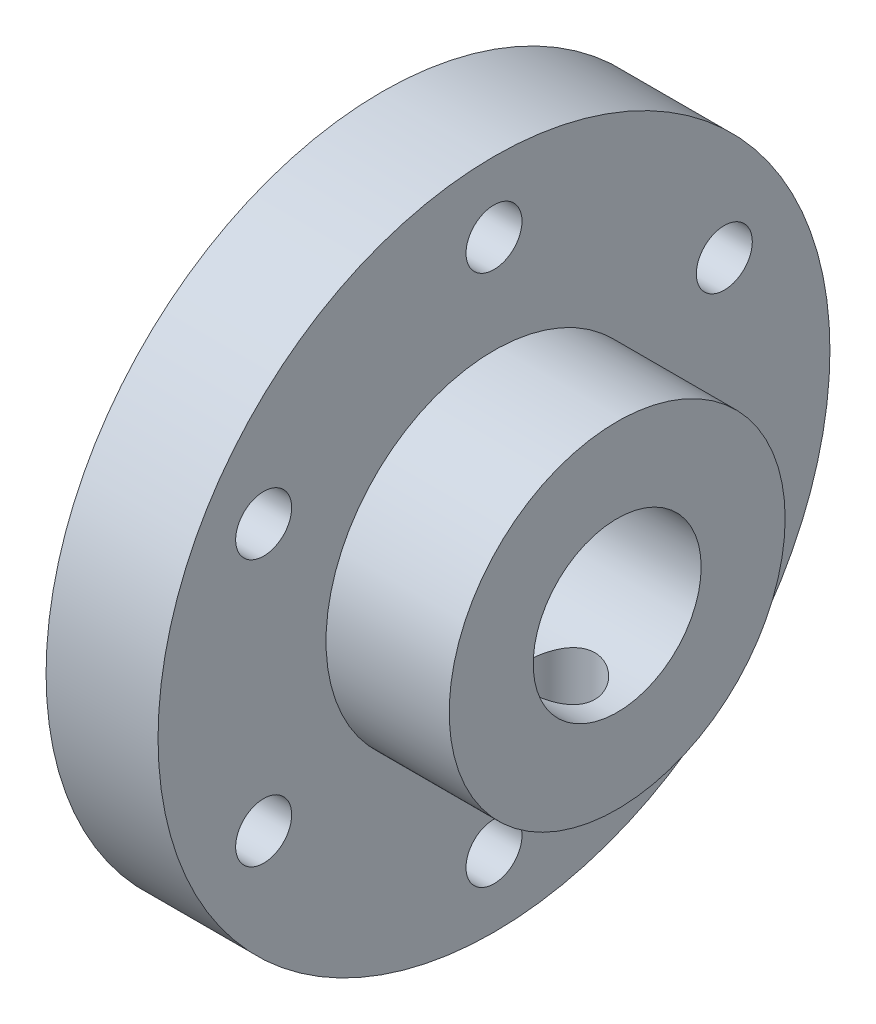
ISO-10303-21;
HEADER;
FILE_DESCRIPTION(('STEP AP214'),'2;1');
FILE_NAME('part.step','',(''),(''),'','','');
FILE_SCHEMA(('AUTOMOTIVE_DESIGN { 1 0 10303 214 1 1 1 1 }'));
ENDSEC;
DATA;
#1=APPLICATION_CONTEXT('core data for automotive mechanical design processes');
#2=APPLICATION_PROTOCOL_DEFINITION('international standard','automotive_design',2000,#1);
#3=PRODUCT_CONTEXT('',#1,'mechanical');
#4=PRODUCT('Part','Part','',(#3));
#5=PRODUCT_RELATED_PRODUCT_CATEGORY('part','',(#4));
#6=PRODUCT_DEFINITION_FORMATION('','',#4);
#7=PRODUCT_DEFINITION_CONTEXT('part definition',#1,'design');
#8=PRODUCT_DEFINITION('design','',#6,#7);
#9=PRODUCT_DEFINITION_SHAPE('','',#8);
#10=(LENGTH_UNIT() NAMED_UNIT(*) SI_UNIT(.MILLI.,.METRE.));
#11=(NAMED_UNIT(*) PLANE_ANGLE_UNIT() SI_UNIT($,.RADIAN.));
#12=(NAMED_UNIT(*) SI_UNIT($,.STERADIAN.) SOLID_ANGLE_UNIT());
#13=UNCERTAINTY_MEASURE_WITH_UNIT(LENGTH_MEASURE(1.E-05),#10,'distance_accuracy_value','');
#14=(GEOMETRIC_REPRESENTATION_CONTEXT(3) GLOBAL_UNCERTAINTY_ASSIGNED_CONTEXT((#13)) GLOBAL_UNIT_ASSIGNED_CONTEXT((#10,
#11,#12)) REPRESENTATION_CONTEXT('',''));
#15=CARTESIAN_POINT('',(0.,0.,0.));
#16=DIRECTION('',(0.,0.,1.));
#17=DIRECTION('',(1.,0.,0.));
#18=AXIS2_PLACEMENT_3D('',#15,#16,#17);
#19=CARTESIAN_POINT('',(10.,0.,0.));
#20=DIRECTION('',(-1.,0.,0.));
#21=DIRECTION('',(0.,0.,1.));
#22=AXIS2_PLACEMENT_3D('',#19,#20,#21);
#23=CYLINDRICAL_SURFACE('',#22,30.);
#24=CARTESIAN_POINT('',(10.,0.,0.));
#25=DIRECTION('',(1.,0.,0.));
#26=DIRECTION('',(0.,0.,-1.));
#27=AXIS2_PLACEMENT_3D('',#24,#25,#26);
#28=CIRCLE('',#27,30.);
#29=CARTESIAN_POINT('',(10.,0.,-30.));
#30=VERTEX_POINT('',#29);
#31=EDGE_CURVE('E43',#30,#30,#28,.T.);
#32=ORIENTED_EDGE('',*,*,#31,.F.);
#33=EDGE_LOOP('',(#32));
#34=FACE_BOUND('',#33,.T.);
#35=CARTESIAN_POINT('',(0.,0.,0.));
#36=DIRECTION('',(1.,0.,0.));
#37=DIRECTION('',(0.,0.,-1.));
#38=AXIS2_PLACEMENT_3D('',#35,#36,#37);
#39=CIRCLE('',#38,30.);
#40=CARTESIAN_POINT('',(0.,0.,-30.));
#41=VERTEX_POINT('',#40);
#42=EDGE_CURVE('E47',#41,#41,#39,.T.);
#43=ORIENTED_EDGE('',*,*,#42,.T.);
#44=EDGE_LOOP('',(#43));
#45=FACE_BOUND('',#44,.T.);
#46=ADVANCED_FACE('F37',(#34,#45),#23,.T.);
#47=CARTESIAN_POINT('',(10.,0.,0.));
#48=DIRECTION('',(1.,0.,0.));
#49=DIRECTION('',(0.,0.,-1.));
#50=AXIS2_PLACEMENT_3D('',#47,#48,#49);
#51=PLANE('',#50);
#52=CARTESIAN_POINT('',(10.,0.,0.));
#53=DIRECTION('',(1.,0.,0.));
#54=DIRECTION('',(0.,0.,-1.));
#55=AXIS2_PLACEMENT_3D('',#52,#53,#54);
#56=CIRCLE('',#55,15.);
#57=CARTESIAN_POINT('',(10.,0.,-15.));
#58=VERTEX_POINT('',#57);
#59=EDGE_CURVE('E92',#58,#58,#56,.T.);
#60=ORIENTED_EDGE('',*,*,#59,.F.);
#61=EDGE_LOOP('',(#60));
#62=FACE_BOUND('',#61,.T.);
#63=CARTESIAN_POINT('',(10.,23.75,0.));
#64=DIRECTION('',(1.,0.,0.));
#65=DIRECTION('',(0.,0.,-1.));
#66=AXIS2_PLACEMENT_3D('',#63,#64,#65);
#67=CIRCLE('',#66,2.5);
#68=CARTESIAN_POINT('',(10.,23.75,-2.5));
#69=VERTEX_POINT('',#68);
#70=EDGE_CURVE('E79',#69,#69,#67,.T.);
#71=ORIENTED_EDGE('',*,*,#70,.F.);
#72=EDGE_LOOP('',(#71));
#73=FACE_BOUND('',#72,.T.);
#74=CARTESIAN_POINT('',(10.,11.8749999999991,20.5681033398799));
#75=DIRECTION('',(1.,0.,0.));
#76=DIRECTION('',(0.,0.,-1.));
#77=AXIS2_PLACEMENT_3D('',#74,#75,#76);
#78=CIRCLE('',#77,2.5);
#79=CARTESIAN_POINT('',(10.,11.8749999999991,18.0681033398799));
#80=VERTEX_POINT('',#79);
#81=EDGE_CURVE('E80',#80,#80,#78,.T.);
#82=ORIENTED_EDGE('',*,*,#81,.F.);
#83=EDGE_LOOP('',(#82));
#84=FACE_BOUND('',#83,.T.);
#85=CARTESIAN_POINT('',(10.,-11.8750000000009,20.5681033398789));
#86=DIRECTION('',(1.,0.,0.));
#87=DIRECTION('',(0.,0.,-1.));
#88=AXIS2_PLACEMENT_3D('',#85,#86,#87);
#89=CIRCLE('',#88,2.5);
#90=CARTESIAN_POINT('',(10.,-11.8750000000009,18.0681033398789));
#91=VERTEX_POINT('',#90);
#92=EDGE_CURVE('E54',#91,#91,#89,.T.);
#93=ORIENTED_EDGE('',*,*,#92,.F.);
#94=EDGE_LOOP('',(#93));
#95=FACE_BOUND('',#94,.T.);
#96=CARTESIAN_POINT('',(10.,-23.75,-2.07990264065103E-12));
#97=DIRECTION('',(1.,0.,0.));
#98=DIRECTION('',(0.,0.,-1.));
#99=AXIS2_PLACEMENT_3D('',#96,#97,#98);
#100=CIRCLE('',#99,2.5);
#101=CARTESIAN_POINT('',(10.,-23.75,-2.50000000000208));
#102=VERTEX_POINT('',#101);
#103=EDGE_CURVE('E61',#102,#102,#100,.T.);
#104=ORIENTED_EDGE('',*,*,#103,.F.);
#105=EDGE_LOOP('',(#104));
#106=FACE_BOUND('',#105,.T.);
#107=CARTESIAN_POINT('',(10.,-11.8749999999991,-20.568103339882));
#108=DIRECTION('',(1.,0.,0.));
#109=DIRECTION('',(0.,0.,-1.));
#110=AXIS2_PLACEMENT_3D('',#107,#108,#109);
#111=CIRCLE('',#110,2.5);
#112=CARTESIAN_POINT('',(10.,-11.8749999999991,-23.068103339882));
#113=VERTEX_POINT('',#112);
#114=EDGE_CURVE('E67',#113,#113,#111,.T.);
#115=ORIENTED_EDGE('',*,*,#114,.F.);
#116=EDGE_LOOP('',(#115));
#117=FACE_BOUND('',#116,.T.);
#118=CARTESIAN_POINT('',(10.,11.8750000000009,-20.5681033398809));
#119=DIRECTION('',(1.,0.,0.));
#120=DIRECTION('',(0.,0.,-1.));
#121=AXIS2_PLACEMENT_3D('',#118,#119,#120);
#122=CIRCLE('',#121,2.5);
#123=CARTESIAN_POINT('',(10.,11.8750000000009,-23.0681033398809));
#124=VERTEX_POINT('',#123);
#125=EDGE_CURVE('E73',#124,#124,#122,.T.);
#126=ORIENTED_EDGE('',*,*,#125,.F.);
#127=EDGE_LOOP('',(#126));
#128=FACE_BOUND('',#127,.T.);
#129=ORIENTED_EDGE('',*,*,#31,.T.);
#130=EDGE_LOOP('',(#129));
#131=FACE_BOUND('',#130,.T.);
#132=ADVANCED_FACE('F166',(#62,#73,#84,#95,#106,#117,#128,#131),#51,.T.);
#133=CARTESIAN_POINT('',(0.,0.,0.));
#134=DIRECTION('',(1.,0.,0.));
#135=DIRECTION('',(0.,0.,-1.));
#136=AXIS2_PLACEMENT_3D('',#133,#134,#135);
#137=PLANE('',#136);
#138=CARTESIAN_POINT('',(0.,0.,0.));
#139=DIRECTION('',(1.,0.,0.));
#140=DIRECTION('',(0.,0.,-1.));
#141=AXIS2_PLACEMENT_3D('',#138,#139,#140);
#142=CIRCLE('',#141,14.);
#143=CARTESIAN_POINT('',(0.,0.,-14.));
#144=VERTEX_POINT('',#143);
#145=EDGE_CURVE('E10',#144,#144,#142,.F.);
#146=ORIENTED_EDGE('',*,*,#145,.F.);
#147=EDGE_LOOP('',(#146));
#148=FACE_BOUND('',#147,.T.);
#149=CARTESIAN_POINT('',(0.,23.75,0.));
#150=DIRECTION('',(1.,0.,0.));
#151=DIRECTION('',(0.,0.,-1.));
#152=AXIS2_PLACEMENT_3D('',#149,#150,#151);
#153=CIRCLE('',#152,2.5);
#154=CARTESIAN_POINT('',(0.,23.75,-2.5));
#155=VERTEX_POINT('',#154);
#156=EDGE_CURVE('E52',#155,#155,#153,.T.);
#157=ORIENTED_EDGE('',*,*,#156,.T.);
#158=EDGE_LOOP('',(#157));
#159=FACE_BOUND('',#158,.T.);
#160=CARTESIAN_POINT('',(0.,11.8749999999991,20.5681033398799));
#161=DIRECTION('',(1.,0.,0.));
#162=DIRECTION('',(0.,0.,-1.));
#163=AXIS2_PLACEMENT_3D('',#160,#161,#162);
#164=CIRCLE('',#163,2.5);
#165=CARTESIAN_POINT('',(0.,11.8749999999991,18.0681033398799));
#166=VERTEX_POINT('',#165);
#167=EDGE_CURVE('E58',#166,#166,#164,.T.);
#168=ORIENTED_EDGE('',*,*,#167,.T.);
#169=EDGE_LOOP('',(#168));
#170=FACE_BOUND('',#169,.T.);
#171=CARTESIAN_POINT('',(0.,-11.8750000000009,20.5681033398789));
#172=DIRECTION('',(1.,0.,0.));
#173=DIRECTION('',(0.,0.,-1.));
#174=AXIS2_PLACEMENT_3D('',#171,#172,#173);
#175=CIRCLE('',#174,2.5);
#176=CARTESIAN_POINT('',(0.,-11.8750000000009,18.0681033398789));
#177=VERTEX_POINT('',#176);
#178=EDGE_CURVE('E57',#177,#177,#175,.T.);
#179=ORIENTED_EDGE('',*,*,#178,.T.);
#180=EDGE_LOOP('',(#179));
#181=FACE_BOUND('',#180,.T.);
#182=CARTESIAN_POINT('',(0.,-23.75,-2.07990264065103E-12));
#183=DIRECTION('',(1.,0.,0.));
#184=DIRECTION('',(0.,0.,-1.));
#185=AXIS2_PLACEMENT_3D('',#182,#183,#184);
#186=CIRCLE('',#185,2.5);
#187=CARTESIAN_POINT('',(0.,-23.75,-2.50000000000208));
#188=VERTEX_POINT('',#187);
#189=EDGE_CURVE('E64',#188,#188,#186,.T.);
#190=ORIENTED_EDGE('',*,*,#189,.T.);
#191=EDGE_LOOP('',(#190));
#192=FACE_BOUND('',#191,.T.);
#193=CARTESIAN_POINT('',(0.,-11.8749999999991,-20.568103339882));
#194=DIRECTION('',(1.,0.,0.));
#195=DIRECTION('',(0.,0.,-1.));
#196=AXIS2_PLACEMENT_3D('',#193,#194,#195);
#197=CIRCLE('',#196,2.5);
#198=CARTESIAN_POINT('',(0.,-11.8749999999991,-23.068103339882));
#199=VERTEX_POINT('',#198);
#200=EDGE_CURVE('E70',#199,#199,#197,.T.);
#201=ORIENTED_EDGE('',*,*,#200,.T.);
#202=EDGE_LOOP('',(#201));
#203=FACE_BOUND('',#202,.T.);
#204=CARTESIAN_POINT('',(0.,11.8750000000009,-20.5681033398809));
#205=DIRECTION('',(1.,0.,0.));
#206=DIRECTION('',(0.,0.,-1.));
#207=AXIS2_PLACEMENT_3D('',#204,#205,#206);
#208=CIRCLE('',#207,2.5);
#209=CARTESIAN_POINT('',(0.,11.8750000000009,-23.0681033398809));
#210=VERTEX_POINT('',#209);
#211=EDGE_CURVE('E76',#210,#210,#208,.T.);
#212=ORIENTED_EDGE('',*,*,#211,.T.);
#213=EDGE_LOOP('',(#212));
#214=FACE_BOUND('',#213,.T.);
#215=ORIENTED_EDGE('',*,*,#42,.F.);
#216=EDGE_LOOP('',(#215));
#217=FACE_BOUND('',#216,.T.);
#218=ADVANCED_FACE('F154',(#148,#159,#170,#181,#192,#203,#214,#217),#137,.F.);
#219=CARTESIAN_POINT('',(0.,11.8750000000009,-20.5681033398809));
#220=DIRECTION('',(1.,0.,0.));
#221=DIRECTION('',(0.,0.,-1.));
#222=AXIS2_PLACEMENT_3D('',#219,#220,#221);
#223=CYLINDRICAL_SURFACE('',#222,2.5);
#224=ORIENTED_EDGE('',*,*,#211,.F.);
#225=EDGE_LOOP('',(#224));
#226=FACE_BOUND('',#225,.T.);
#227=ORIENTED_EDGE('',*,*,#125,.T.);
#228=EDGE_LOOP('',(#227));
#229=FACE_BOUND('',#228,.T.);
#230=ADVANCED_FACE('F150',(#226,#229),#223,.F.);
#231=CARTESIAN_POINT('',(0.,-11.8749999999991,-20.568103339882));
#232=DIRECTION('',(1.,0.,0.));
#233=DIRECTION('',(0.,0.,-1.));
#234=AXIS2_PLACEMENT_3D('',#231,#232,#233);
#235=CYLINDRICAL_SURFACE('',#234,2.5);
#236=ORIENTED_EDGE('',*,*,#200,.F.);
#237=EDGE_LOOP('',(#236));
#238=FACE_BOUND('',#237,.T.);
#239=ORIENTED_EDGE('',*,*,#114,.T.);
#240=EDGE_LOOP('',(#239));
#241=FACE_BOUND('',#240,.T.);
#242=ADVANCED_FACE('F153',(#238,#241),#235,.F.);
#243=CARTESIAN_POINT('',(0.,-23.75,-2.07990264065103E-12));
#244=DIRECTION('',(1.,0.,0.));
#245=DIRECTION('',(0.,0.,-1.));
#246=AXIS2_PLACEMENT_3D('',#243,#244,#245);
#247=CYLINDRICAL_SURFACE('',#246,2.5);
#248=ORIENTED_EDGE('',*,*,#189,.F.);
#249=EDGE_LOOP('',(#248));
#250=FACE_BOUND('',#249,.T.);
#251=ORIENTED_EDGE('',*,*,#103,.T.);
#252=EDGE_LOOP('',(#251));
#253=FACE_BOUND('',#252,.T.);
#254=ADVANCED_FACE('F158',(#250,#253),#247,.F.);
#255=CARTESIAN_POINT('',(0.,-11.8750000000009,20.5681033398789));
#256=DIRECTION('',(1.,0.,0.));
#257=DIRECTION('',(0.,0.,-1.));
#258=AXIS2_PLACEMENT_3D('',#255,#256,#257);
#259=CYLINDRICAL_SURFACE('',#258,2.5);
#260=ORIENTED_EDGE('',*,*,#178,.F.);
#261=EDGE_LOOP('',(#260));
#262=FACE_BOUND('',#261,.T.);
#263=ORIENTED_EDGE('',*,*,#92,.T.);
#264=EDGE_LOOP('',(#263));
#265=FACE_BOUND('',#264,.T.);
#266=ADVANCED_FACE('F148',(#262,#265),#259,.F.);
#267=CARTESIAN_POINT('',(0.,11.8749999999991,20.5681033398799));
#268=DIRECTION('',(1.,0.,0.));
#269=DIRECTION('',(0.,0.,-1.));
#270=AXIS2_PLACEMENT_3D('',#267,#268,#269);
#271=CYLINDRICAL_SURFACE('',#270,2.5);
#272=ORIENTED_EDGE('',*,*,#167,.F.);
#273=EDGE_LOOP('',(#272));
#274=FACE_BOUND('',#273,.T.);
#275=ORIENTED_EDGE('',*,*,#81,.T.);
#276=EDGE_LOOP('',(#275));
#277=FACE_BOUND('',#276,.T.);
#278=ADVANCED_FACE('F144',(#274,#277),#271,.F.);
#279=CARTESIAN_POINT('',(0.,23.75,0.));
#280=DIRECTION('',(1.,0.,0.));
#281=DIRECTION('',(0.,0.,-1.));
#282=AXIS2_PLACEMENT_3D('',#279,#280,#281);
#283=CYLINDRICAL_SURFACE('',#282,2.5);
#284=ORIENTED_EDGE('',*,*,#156,.F.);
#285=EDGE_LOOP('',(#284));
#286=FACE_BOUND('',#285,.T.);
#287=ORIENTED_EDGE('',*,*,#70,.T.);
#288=EDGE_LOOP('',(#287));
#289=FACE_BOUND('',#288,.T.);
#290=ADVANCED_FACE('F140',(#286,#289),#283,.F.);
#291=CARTESIAN_POINT('',(-6.,0.,0.));
#292=DIRECTION('',(1.,0.,0.));
#293=DIRECTION('',(0.,0.,-1.));
#294=AXIS2_PLACEMENT_3D('',#291,#292,#293);
#295=CYLINDRICAL_SURFACE('',#294,14.);
#296=CARTESIAN_POINT('',(-6.,0.,0.));
#297=DIRECTION('',(-1.,0.,0.));
#298=DIRECTION('',(0.,0.,1.));
#299=AXIS2_PLACEMENT_3D('',#296,#297,#298);
#300=CIRCLE('',#299,14.);
#301=CARTESIAN_POINT('',(-6.,0.,14.));
#302=VERTEX_POINT('',#301);
#303=EDGE_CURVE('E83',#302,#302,#300,.T.);
#304=ORIENTED_EDGE('',*,*,#303,.F.);
#305=EDGE_LOOP('',(#304));
#306=FACE_BOUND('',#305,.T.);
#307=ORIENTED_EDGE('',*,*,#145,.T.);
#308=EDGE_LOOP('',(#307));
#309=FACE_BOUND('',#308,.T.);
#310=ADVANCED_FACE('F136',(#306,#309),#295,.T.);
#311=CARTESIAN_POINT('',(-6.,0.,0.));
#312=DIRECTION('',(-1.,0.,0.));
#313=DIRECTION('',(0.,0.,1.));
#314=AXIS2_PLACEMENT_3D('',#311,#312,#313);
#315=PLANE('',#314);
#316=CARTESIAN_POINT('',(-6.,0.,0.));
#317=DIRECTION('',(-1.,0.,0.));
#318=DIRECTION('',(0.,0.,1.));
#319=AXIS2_PLACEMENT_3D('',#316,#317,#318);
#320=CIRCLE('',#319,7.5);
#321=CARTESIAN_POINT('',(-6.,0.,7.5));
#322=VERTEX_POINT('',#321);
#323=EDGE_CURVE('E99',#322,#322,#320,.F.);
#324=ORIENTED_EDGE('',*,*,#323,.T.);
#325=EDGE_LOOP('',(#324));
#326=FACE_BOUND('',#325,.T.);
#327=ORIENTED_EDGE('',*,*,#303,.T.);
#328=EDGE_LOOP('',(#327));
#329=FACE_BOUND('',#328,.T.);
#330=ADVANCED_FACE('F132',(#326,#329),#315,.T.);
#331=CARTESIAN_POINT('',(11.,0.,0.));
#332=DIRECTION('',(-1.,0.,0.));
#333=DIRECTION('',(0.,0.,1.));
#334=AXIS2_PLACEMENT_3D('',#331,#332,#333);
#335=CYLINDRICAL_SURFACE('',#334,15.);
#336=CARTESIAN_POINT('',(16.,-14.6969384566991,-3.));
#337=CARTESIAN_POINT('',(16.1666931264735,-14.6969417707994,-2.99999383762581));
#338=CARTESIAN_POINT('',(16.33346387,-14.6998052480611,-2.98605951515443));
#339=CARTESIAN_POINT('',(16.6622875154294,-14.7109329391462,-2.93073685074852));
#340=CARTESIAN_POINT('',(16.8243365339079,-14.7192014743436,-2.88932654121148));
#341=CARTESIAN_POINT('',(17.1389119100626,-14.7401662116556,-2.78038734785923));
#342=CARTESIAN_POINT('',(17.2914475645978,-14.7528580086323,-2.71288444245786));
#343=CARTESIAN_POINT('',(17.5830245340909,-14.7812339844198,-2.55374732301151));
#344=CARTESIAN_POINT('',(17.7220666016137,-14.7969179962038,-2.46211445580345));
#345=CARTESIAN_POINT('',(17.9846830115616,-14.8297589908276,-2.25593722696031));
#346=CARTESIAN_POINT('',(18.1080387636519,-14.8469321351174,-2.14111696773995));
#347=CARTESIAN_POINT('',(18.3338726007369,-14.880674169078,-1.89242036706393));
#348=CARTESIAN_POINT('',(18.4363492222516,-14.8972430163249,-1.75854269093395));
#349=CARTESIAN_POINT('',(18.6183640528854,-14.9280838925269,-1.47408406777276));
#350=CARTESIAN_POINT('',(18.6976945414499,-14.9423346432465,-1.32336770301663));
#351=CARTESIAN_POINT('',(18.8298248111444,-14.9667521065089,-1.01041245116181));
#352=CARTESIAN_POINT('',(18.882627075703,-14.9769192013236,-0.848174644261655));
#353=CARTESIAN_POINT('',(18.9595215808589,-14.9919096206526,-0.519050319835479));
#354=CARTESIAN_POINT('',(18.983982932713,-14.9968015886438,-0.352253217644439));
#355=CARTESIAN_POINT('',(19.0046528555149,-15.0009276355081,-0.0168557053126058));
#356=CARTESIAN_POINT('',(19.0008641489375,-15.0001622595828,0.151744529495532));
#357=CARTESIAN_POINT('',(18.9654214593533,-14.9931130460555,0.483426002230768));
#358=CARTESIAN_POINT('',(18.9341650684964,-14.9869079509751,0.646551642895411));
#359=CARTESIAN_POINT('',(18.8453049026233,-14.9697653147823,0.965194879740903));
#360=CARTESIAN_POINT('',(18.7877000734244,-14.9588275843212,1.12071217124139));
#361=CARTESIAN_POINT('',(18.6474098795582,-14.9333188805988,1.42085838960266));
#362=CARTESIAN_POINT('',(18.5645687466853,-14.9187254452567,1.5654125224017));
#363=CARTESIAN_POINT('',(18.3762727682902,-14.8875140842136,1.83871513757927));
#364=CARTESIAN_POINT('',(18.2708153206884,-14.8708959256567,1.967461798575));
#365=CARTESIAN_POINT('',(18.0380991336746,-14.8371289309338,2.20785429316037));
#366=CARTESIAN_POINT('',(17.9104924398112,-14.8199758937255,2.31916294972089));
#367=CARTESIAN_POINT('',(17.6382506726477,-14.7873471479628,2.51885547953042));
#368=CARTESIAN_POINT('',(17.4936152773504,-14.7718714711364,2.60723891918325));
#369=CARTESIAN_POINT('',(17.1909375045346,-14.7443414241877,2.75868844440564));
#370=CARTESIAN_POINT('',(17.032867097081,-14.7322944469065,2.82169994333313));
#371=CARTESIAN_POINT('',(16.708086028828,-14.7130942896382,2.92017102488274));
#372=CARTESIAN_POINT('',(16.5413764971427,-14.7059404718528,2.95563419836993));
#373=CARTESIAN_POINT('',(16.2071054260029,-14.6974643780348,2.99749801810815));
#374=CARTESIAN_POINT('',(16.039607277069,-14.6960444117146,3.00438557669373));
#375=CARTESIAN_POINT('',(15.7058553304009,-14.6989345706656,2.99021288493221));
#376=CARTESIAN_POINT('',(15.5396014626434,-14.7032443710116,2.96915421936732));
#377=CARTESIAN_POINT('',(15.2146940791233,-14.7170169748474,2.90010662422247));
#378=CARTESIAN_POINT('',(15.0559829708927,-14.7264299704349,2.85237786251789));
#379=CARTESIAN_POINT('',(14.7488101629138,-14.7493046805499,2.73162310592555));
#380=CARTESIAN_POINT('',(14.6003493086928,-14.7627667285881,2.65859502711953));
#381=CARTESIAN_POINT('',(14.3157606701495,-14.7924421788612,2.48821242664679));
#382=CARTESIAN_POINT('',(14.1798188610975,-14.8086891559471,2.39055323394826));
#383=CARTESIAN_POINT('',(13.9260750639972,-14.8420117147991,2.17408671663813));
#384=CARTESIAN_POINT('',(13.8082749452522,-14.8590873817145,2.05527721543361));
#385=CARTESIAN_POINT('',(13.5923123224433,-14.8924603760765,1.79769682049367));
#386=CARTESIAN_POINT('',(13.49447903605,-14.9087417312605,1.65864749678888));
#387=CARTESIAN_POINT('',(13.3235623555012,-14.9384138288586,1.36580368990426));
#388=CARTESIAN_POINT('',(13.2504779219657,-14.9518046926563,1.21200982630052));
#389=CARTESIAN_POINT('',(13.1316133847601,-14.974118821832,0.894908042472034));
#390=CARTESIAN_POINT('',(13.0856784453212,-14.9830673742781,0.73166002043423));
#391=CARTESIAN_POINT('',(13.0219262570085,-14.9955970781298,0.399568364039731));
#392=CARTESIAN_POINT('',(13.004105621573,-14.9991788759955,0.230725406133631));
#393=CARTESIAN_POINT('',(12.9972190571113,-15.0005562136234,-0.104618681710867));
#394=CARTESIAN_POINT('',(13.0076581586313,-14.9984513564799,-0.271109436424486));
#395=CARTESIAN_POINT('',(13.0559018516435,-14.9889013068102,-0.599913093946953));
#396=CARTESIAN_POINT('',(13.0937060990444,-14.9814561814329,-0.76222604926117));
#397=CARTESIAN_POINT('',(13.1953869762748,-14.9620649509476,-1.0777582492352));
#398=CARTESIAN_POINT('',(13.2592041343929,-14.9501291174284,-1.2309973297205));
#399=CARTESIAN_POINT('',(13.4110367239933,-14.9230416637104,-1.52466366055821));
#400=CARTESIAN_POINT('',(13.4990540677135,-14.9078897894096,-1.66508989730354));
#401=CARTESIAN_POINT('',(13.6984581611839,-14.8757279747022,-1.93159167031775));
#402=CARTESIAN_POINT('',(13.8101990091513,-14.858692002537,-2.05739914834453));
#403=CARTESIAN_POINT('',(14.0531507202963,-14.8248366872359,-2.28864785327552));
#404=CARTESIAN_POINT('',(14.1843661884398,-14.8080173963616,-2.39408424962674));
#405=CARTESIAN_POINT('',(14.4642379500713,-14.7763002820179,-2.58267665834994));
#406=CARTESIAN_POINT('',(14.6130668833638,-14.7614251071368,-2.66558044385427));
#407=CARTESIAN_POINT('',(14.9227983197803,-14.7355571137924,-2.80507214779868));
#408=CARTESIAN_POINT('',(15.0836897160616,-14.7245607757495,-2.86168393792249));
#409=CARTESIAN_POINT('',(15.3707873663286,-14.7098904341354,-2.93600741957296));
#410=CARTESIAN_POINT('',(15.4953562585419,-14.7050635474382,-2.95996169557105));
#411=CARTESIAN_POINT('',(15.7466018636534,-14.6985863537725,-2.99196005387913));
#412=CARTESIAN_POINT('',(15.8732785037334,-14.6969359372925,-3.00000468468793));
#413=CARTESIAN_POINT('',(16.,-14.6969384566991,-3.));
#414=B_SPLINE_CURVE_WITH_KNOTS('',3,(#336,#337,#338,#339,#340,#341,#342,#343,#344,#345,#346,
#347,#348,#349,#350,#351,#352,#353,#354,#355,#356,#357,#358,#359,#360,#361,#362,#363,#364,#365,
#366,#367,#368,#369,#370,#371,#372,#373,#374,#375,#376,#377,#378,#379,#380,#381,#382,#383,#384,
#385,#386,#387,#388,#389,#390,#391,#392,#393,#394,#395,#396,#397,#398,#399,#400,#401,#402,#403,
#404,#405,#406,#407,#408,#409,#410,#411,#412,#413),.UNSPECIFIED.,.T.,.F.,(4,2,2,2,2,2,2,2,2,2,2,
2,2,2,2,2,2,2,2,2,2,2,2,2,2,2,2,2,2,2,2,2,2,2,2,2,2,2,4),(0.,0.499615391608283,
0.999630717852891,1.49914949382176,1.99864039457959,2.5044675764531,3.01033020106266,
3.52060201312351,4.03082604739679,4.53432746649241,5.03778036348745,5.53406368900612,
6.0303668722125,6.52979772666909,7.02928607310198,7.53748040287449,8.0456843436816,
8.5549758951833,9.06420105048073,9.5647127341378,10.0651960358526,10.5608802534996,
11.0566053106319,11.5587917932356,12.0610299861063,12.5709780520035,13.0809046989031,
13.5878944073595,14.0948230407488,14.5929305224406,15.0910317410027,15.5880005122635,
16.0850085640405,16.5900345607679,17.0951801666934,17.6057669573882,18.1158892527059,
18.4957141091448,18.8755258705644),.UNSPECIFIED.);
#415=CARTESIAN_POINT('',(16.,-14.6969384566991,-3.));
#416=VERTEX_POINT('',#415);
#417=EDGE_CURVE('E102',#416,#416,#414,.T.);
#418=ORIENTED_EDGE('',*,*,#417,.F.);
#419=EDGE_LOOP('',(#418));
#420=FACE_BOUND('',#419,.T.);
#421=ORIENTED_EDGE('',*,*,#59,.T.);
#422=EDGE_LOOP('',(#421));
#423=FACE_BOUND('',#422,.T.);
#424=CARTESIAN_POINT('',(21.,0.,0.));
#425=DIRECTION('',(1.,0.,0.));
#426=DIRECTION('',(0.,0.,-1.));
#427=AXIS2_PLACEMENT_3D('',#424,#425,#426);
#428=CIRCLE('',#427,15.);
#429=CARTESIAN_POINT('',(21.,0.,-15.));
#430=VERTEX_POINT('',#429);
#431=EDGE_CURVE('E95',#430,#430,#428,.T.);
#432=ORIENTED_EDGE('',*,*,#431,.F.);
#433=EDGE_LOOP('',(#432));
#434=FACE_BOUND('',#433,.T.);
#435=ADVANCED_FACE('F128',(#420,#423,#434),#335,.T.);
#436=CARTESIAN_POINT('',(21.,0.,0.));
#437=DIRECTION('',(1.,0.,0.));
#438=DIRECTION('',(0.,0.,-1.));
#439=AXIS2_PLACEMENT_3D('',#436,#437,#438);
#440=PLANE('',#439);
#441=CARTESIAN_POINT('',(21.,0.,0.));
#442=DIRECTION('',(1.,0.,0.));
#443=DIRECTION('',(0.,0.,-1.));
#444=AXIS2_PLACEMENT_3D('',#441,#442,#443);
#445=CIRCLE('',#444,7.5);
#446=CARTESIAN_POINT('',(21.,0.,-7.5));
#447=VERTEX_POINT('',#446);
#448=EDGE_CURVE('E98',#447,#447,#445,.T.);
#449=ORIENTED_EDGE('',*,*,#448,.F.);
#450=EDGE_LOOP('',(#449));
#451=FACE_BOUND('',#450,.T.);
#452=ORIENTED_EDGE('',*,*,#431,.T.);
#453=EDGE_LOOP('',(#452));
#454=FACE_BOUND('',#453,.T.);
#455=ADVANCED_FACE('F124',(#451,#454),#440,.T.);
#456=CARTESIAN_POINT('',(-6.001,0.,0.));
#457=DIRECTION('',(1.,0.,0.));
#458=DIRECTION('',(0.,0.,-1.));
#459=AXIS2_PLACEMENT_3D('',#456,#457,#458);
#460=CYLINDRICAL_SURFACE('',#459,7.5);
#461=CARTESIAN_POINT('',(16.,-6.87386354243376,-3.));
#462=CARTESIAN_POINT('',(15.8393144654306,-6.87387034169605,-2.99999310102033));
#463=CARTESIAN_POINT('',(15.6783605585022,-6.87957650695684,-2.9870126033011));
#464=CARTESIAN_POINT('',(15.3610913738506,-6.901666249599,-2.93560066312234));
#465=CARTESIAN_POINT('',(15.2047890184922,-6.9180771094252,-2.89710418548511));
#466=CARTESIAN_POINT('',(14.9019222865438,-6.95940616078833,-2.79635331714323));
#467=CARTESIAN_POINT('',(14.7553236350632,-6.98429226391323,-2.73418843497826));
#468=CARTESIAN_POINT('',(14.4746719677066,-7.0397201578331,-2.58813019791228));
#469=CARTESIAN_POINT('',(14.3406162212138,-7.07026071330917,-2.5042415873656));
#470=CARTESIAN_POINT('',(14.0811095281835,-7.13551292343503,-2.31198302134881));
#471=CARTESIAN_POINT('',(13.9564654009041,-7.17035875533909,-2.20256905254826));
#472=CARTESIAN_POINT('',(13.7267064687163,-7.23918686872916,-1.96456364269823));
#473=CARTESIAN_POINT('',(13.6215984884354,-7.27316884487642,-1.8359655281602));
#474=CARTESIAN_POINT('',(13.4298904145354,-7.33805111462092,-1.55700947005954));
#475=CARTESIAN_POINT('',(13.3441835504711,-7.36877705418855,-1.40599344962864));
#476=CARTESIAN_POINT('',(13.1997346447393,-7.42205891553774,-1.09023798310295));
#477=CARTESIAN_POINT('',(13.1409816306267,-7.44461816104874,-0.925504153615321));
#478=CARTESIAN_POINT('',(13.0549877710104,-7.47807487485913,-0.595449640559627));
#479=CARTESIAN_POINT('',(13.0263590290447,-7.48948405155942,-0.430543477287472));
#480=CARTESIAN_POINT('',(12.9969572713278,-7.50120466031146,-0.0978994928759408));
#481=CARTESIAN_POINT('',(12.9961738660513,-7.50152023155834,0.0698372487591188));
#482=CARTESIAN_POINT('',(13.0217241547063,-7.49132944230918,0.393348742053135));
#483=CARTESIAN_POINT('',(13.0465371591321,-7.48142995157228,0.549266179305687));
#484=CARTESIAN_POINT('',(13.1199893144545,-7.45273937203712,0.854509663832871));
#485=CARTESIAN_POINT('',(13.1686302135977,-7.43394763082012,1.00383522658686));
#486=CARTESIAN_POINT('',(13.2889547243174,-7.388952366862,1.29434690776584));
#487=CARTESIAN_POINT('',(13.3609745722231,-7.36264140699335,1.43537643506834));
#488=CARTESIAN_POINT('',(13.5256975103787,-7.30521877770412,1.70371222611197));
#489=CARTESIAN_POINT('',(13.6184076896503,-7.27410546400724,1.83101376407694));
#490=CARTESIAN_POINT('',(13.8289737039158,-7.20782455764184,2.07715324198526));
#491=CARTESIAN_POINT('',(13.9480808388592,-7.17252489767638,2.19488676789948));
#492=CARTESIAN_POINT('',(14.204485857748,-7.10342491459894,2.40916112308897));
#493=CARTESIAN_POINT('',(14.3417896722934,-7.06962508512115,2.50569501568047));
#494=CARTESIAN_POINT('',(14.6356285335609,-7.00645346113535,2.67735628307891));
#495=CARTESIAN_POINT('',(14.792597245508,-6.97723371086562,2.75180197745439));
#496=CARTESIAN_POINT('',(15.1183232354683,-6.92831385516127,2.87276438979969));
#497=CARTESIAN_POINT('',(15.2870727770899,-6.90860756836966,2.91929924756697));
#498=CARTESIAN_POINT('',(15.6205536662012,-6.88244639554074,2.98043242328234));
#499=CARTESIAN_POINT('',(15.7849006706928,-6.87525549684207,2.99680814522181));
#500=CARTESIAN_POINT('',(16.1141158116393,-6.87284246803558,3.00234198966433));
#501=CARTESIAN_POINT('',(16.2789837749135,-6.87761670840543,2.99150836588692));
#502=CARTESIAN_POINT('',(16.5946884024354,-6.8978406653867,2.94454934218504));
#503=CARTESIAN_POINT('',(16.7457894061001,-6.91266686697452,2.90989959303579));
#504=CARTESIAN_POINT('',(17.0399326071782,-6.9505507654101,2.8182062803663));
#505=CARTESIAN_POINT('',(17.1829730096607,-6.97361028732897,2.76115775145341));
#506=CARTESIAN_POINT('',(17.4634035366935,-7.02650672790152,2.62370345922236));
#507=CARTESIAN_POINT('',(17.6003292830418,-7.05658056958766,2.54244430239697));
#508=CARTESIAN_POINT('',(17.8592244811624,-7.11975577736693,2.35974783666273));
#509=CARTESIAN_POINT('',(17.9811878091932,-7.15285837344067,2.25830231022284));
#510=CARTESIAN_POINT('',(18.2160601128991,-7.22131373957125,2.02926631752086));
#511=CARTESIAN_POINT('',(18.3276348479374,-7.2566521092785,1.90029814416815));
#512=CARTESIAN_POINT('',(18.5277656149147,-7.32329691851298,1.62462545005276));
#513=CARTESIAN_POINT('',(18.6163207098927,-7.35460319389703,1.47792020769991));
#514=CARTESIAN_POINT('',(18.767571439695,-7.40975573850585,1.17041990100452));
#515=CARTESIAN_POINT('',(18.8302732662605,-7.4336037936099,1.00962822149811));
#516=CARTESIAN_POINT('',(18.9273232785996,-7.47109070203356,0.678590386371818));
#517=CARTESIAN_POINT('',(18.961686852116,-7.48473509559155,0.508349415415226));
#518=CARTESIAN_POINT('',(18.9992570524793,-7.49968512317788,0.175224765543921));
#519=CARTESIAN_POINT('',(19.004350192843,-7.50173770124618,0.0125857389781284));
#520=CARTESIAN_POINT('',(18.9882167809248,-7.49529063560582,-0.3111507536884));
#521=CARTESIAN_POINT('',(18.9669942127666,-7.48679258923161,-0.472248449421581));
#522=CARTESIAN_POINT('',(18.9001798180002,-7.46057270072754,-0.783256352600096));
#523=CARTESIAN_POINT('',(18.8553565828652,-7.44314221048496,-0.933358205797303));
#524=CARTESIAN_POINT('',(18.7434207911784,-7.40092421651037,-1.2238835333139));
#525=CARTESIAN_POINT('',(18.6763041235914,-7.37613535594289,-1.36430521678368));
#526=CARTESIAN_POINT('',(18.5183452099701,-7.320271419178,-1.63830455820773));
#527=CARTESIAN_POINT('',(18.4265855870123,-7.288966960308,-1.77130556278107));
#528=CARTESIAN_POINT('',(18.2233171918795,-7.2238410334062,-2.0205810602219));
#529=CARTESIAN_POINT('',(18.1118002455877,-7.19001852696379,-2.13684859379602));
#530=CARTESIAN_POINT('',(17.864027279727,-7.1210665105152,-2.35680182841674));
#531=CARTESIAN_POINT('',(17.7266671372838,-7.08598570842144,-2.45926306504163));
#532=CARTESIAN_POINT('',(17.4355863464188,-7.02074485276124,-2.63977144144724));
#533=CARTESIAN_POINT('',(17.2818637773197,-6.99058537793172,-2.71781571083651));
#534=CARTESIAN_POINT('',(16.9764457202947,-6.94138371358595,-2.84098572677451));
#535=CARTESIAN_POINT('',(16.8258075959313,-6.92158645020622,-2.88843803497901));
#536=CARTESIAN_POINT('',(16.518266437761,-6.8916873905118,-2.95907986392734));
#537=CARTESIAN_POINT('',(16.3613821398635,-6.88155858435653,-2.98233699287411));
#538=CARTESIAN_POINT('',(16.1698326413327,-6.87587645913135,-2.99538303278269));
#539=CARTESIAN_POINT('',(16.1358977794653,-6.87512296675926,-2.99711296127842));
#540=CARTESIAN_POINT('',(16.0679792848042,-6.87411577084084,-2.99942221686375));
#541=CARTESIAN_POINT('',(16.0339956486173,-6.8738621039388,-3.0000014595918));
#542=CARTESIAN_POINT('',(16.,-6.87386354243376,-3.));
#543=B_SPLINE_CURVE_WITH_KNOTS('',3,(#461,#462,#463,#464,#465,#466,#467,#468,#469,#470,#471,
#472,#473,#474,#475,#476,#477,#478,#479,#480,#481,#482,#483,#484,#485,#486,#487,#488,#489,#490,
#491,#492,#493,#494,#495,#496,#497,#498,#499,#500,#501,#502,#503,#504,#505,#506,#507,#508,#509,
#510,#511,#512,#513,#514,#515,#516,#517,#518,#519,#520,#521,#522,#523,#524,#525,#526,#527,#528,
#529,#530,#531,#532,#533,#534,#535,#536,#537,#538,#539,#540,#541,#542),.UNSPECIFIED.,.T.,.F.,(4,
2,2,2,2,2,2,2,2,2,2,2,2,2,2,2,2,2,2,2,2,2,2,2,2,2,2,2,2,2,2,2,2,2,2,2,2,2,2,2,4),(0.,
0.481916473151483,0.965066003733368,1.44640623494008,1.92764143235792,2.43383427426637,
2.94020361522513,3.46654003637142,3.9926620045422,4.49331274330775,4.99377667958508,
5.46612967245453,5.93851732693589,6.41802450352347,6.89769622410046,7.40886066122033,
7.9201921069069,8.44596688075886,8.97139957200151,9.4647322128663,9.95791522361908,
10.4230087212772,10.8882053797746,11.3722673197905,11.8565267178877,12.3765560137047,
12.8966064727912,13.4165323096922,13.936175639312,14.4219155963393,14.907582022689,
15.3783299166503,15.8491646674288,16.3408057670989,16.8326507484631,17.3549437992842,
17.8772982263878,18.3527499122861,18.8268694532887,18.928819278144,19.0307765770883),.UNSPECIFIED.);
#544=CARTESIAN_POINT('',(16.,-6.87386354243376,-3.));
#545=VERTEX_POINT('',#544);
#546=EDGE_CURVE('E112',#545,#545,#543,.T.);
#547=ORIENTED_EDGE('',*,*,#546,.F.);
#548=EDGE_LOOP('',(#547));
#549=FACE_BOUND('',#548,.T.);
#550=ORIENTED_EDGE('',*,*,#323,.F.);
#551=EDGE_LOOP('',(#550));
#552=FACE_BOUND('',#551,.T.);
#553=ORIENTED_EDGE('',*,*,#448,.T.);
#554=EDGE_LOOP('',(#553));
#555=FACE_BOUND('',#554,.T.);
#556=ADVANCED_FACE('F121',(#549,#552,#555),#460,.F.);
#557=CARTESIAN_POINT('',(16.,30.001,0.));
#558=DIRECTION('',(0.,-1.,0.));
#559=DIRECTION('',(0.,0.,-1.));
#560=AXIS2_PLACEMENT_3D('',#557,#558,#559);
#561=CYLINDRICAL_SURFACE('',#560,3.);
#562=ORIENTED_EDGE('',*,*,#546,.T.);
#563=EDGE_LOOP('',(#562));
#564=FACE_BOUND('',#563,.T.);
#565=ORIENTED_EDGE('',*,*,#417,.T.);
#566=EDGE_LOOP('',(#565));
#567=FACE_BOUND('',#566,.T.);
#568=ADVANCED_FACE('F117',(#564,#567),#561,.F.);
#569=CLOSED_SHELL('',(#46,#132,#218,#230,#242,#254,#266,#278,#290,#310,#330,#435,#455,#556,#568));
#570=MANIFOLD_SOLID_BREP('B2',#569);
#571=ADVANCED_BREP_SHAPE_REPRESENTATION('',(#18,#570),#14);
#572=SHAPE_DEFINITION_REPRESENTATION(#9,#571);
ENDSEC;
END-ISO-10303-21;
